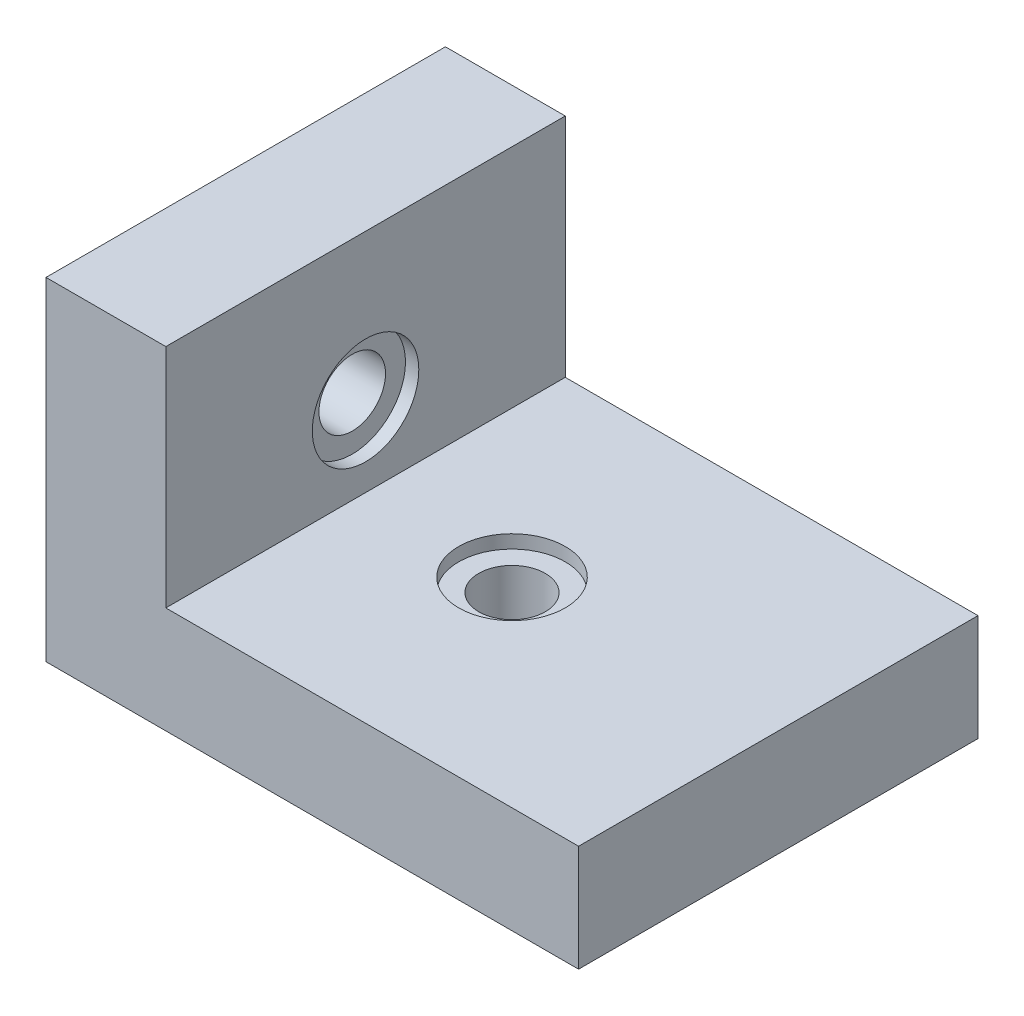
ISO-10303-21;
HEADER;
FILE_DESCRIPTION(('STEP AP214'),'2;1');
FILE_NAME('part.step','',(''),(''),'','','');
FILE_SCHEMA(('AUTOMOTIVE_DESIGN { 1 0 10303 214 1 1 1 1 }'));
ENDSEC;
DATA;
#1=APPLICATION_CONTEXT('core data for automotive mechanical design processes');
#2=APPLICATION_PROTOCOL_DEFINITION('international standard','automotive_design',2000,#1);
#3=PRODUCT_CONTEXT('',#1,'mechanical');
#4=PRODUCT('Part','Part','',(#3));
#5=PRODUCT_RELATED_PRODUCT_CATEGORY('part','',(#4));
#6=PRODUCT_DEFINITION_FORMATION('','',#4);
#7=PRODUCT_DEFINITION_CONTEXT('part definition',#1,'design');
#8=PRODUCT_DEFINITION('design','',#6,#7);
#9=PRODUCT_DEFINITION_SHAPE('','',#8);
#10=(LENGTH_UNIT() NAMED_UNIT(*) SI_UNIT(.MILLI.,.METRE.));
#11=(NAMED_UNIT(*) PLANE_ANGLE_UNIT() SI_UNIT($,.RADIAN.));
#12=(NAMED_UNIT(*) SI_UNIT($,.STERADIAN.) SOLID_ANGLE_UNIT());
#13=UNCERTAINTY_MEASURE_WITH_UNIT(LENGTH_MEASURE(1.E-05),#10,'distance_accuracy_value','');
#14=(GEOMETRIC_REPRESENTATION_CONTEXT(3) GLOBAL_UNCERTAINTY_ASSIGNED_CONTEXT((#13)) GLOBAL_UNIT_ASSIGNED_CONTEXT((#10,
#11,#12)) REPRESENTATION_CONTEXT('',''));
#15=CARTESIAN_POINT('',(0.,0.,0.));
#16=DIRECTION('',(0.,0.,1.));
#17=DIRECTION('',(1.,0.,0.));
#18=AXIS2_PLACEMENT_3D('',#15,#16,#17);
#19=CARTESIAN_POINT('',(9.,14.,15.));
#20=DIRECTION('',(-1.,0.,0.));
#21=DIRECTION('',(0.,0.,1.));
#22=AXIS2_PLACEMENT_3D('',#19,#20,#21);
#23=CYLINDRICAL_SURFACE('',#22,2.5);
#24=CARTESIAN_POINT('',(0.,14.,15.));
#25=DIRECTION('',(1.,0.,0.));
#26=DIRECTION('',(0.,0.,-1.));
#27=AXIS2_PLACEMENT_3D('',#24,#25,#26);
#28=CIRCLE('',#27,2.5);
#29=CARTESIAN_POINT('',(0.,14.,12.5));
#30=VERTEX_POINT('',#29);
#31=EDGE_CURVE('E116',#30,#30,#28,.T.);
#32=ORIENTED_EDGE('',*,*,#31,.F.);
#33=EDGE_LOOP('',(#32));
#34=FACE_BOUND('',#33,.T.);
#35=CARTESIAN_POINT('',(8.,14.,15.));
#36=DIRECTION('',(1.,0.,0.));
#37=DIRECTION('',(0.,0.,-1.));
#38=AXIS2_PLACEMENT_3D('',#35,#36,#37);
#39=CIRCLE('',#38,2.5);
#40=CARTESIAN_POINT('',(8.,14.,12.5));
#41=VERTEX_POINT('',#40);
#42=EDGE_CURVE('E40',#41,#41,#39,.T.);
#43=ORIENTED_EDGE('',*,*,#42,.T.);
#44=EDGE_LOOP('',(#43));
#45=FACE_BOUND('',#44,.T.);
#46=ADVANCED_FACE('F36',(#34,#45),#23,.F.);
#47=CARTESIAN_POINT('',(20.,8.,15.));
#48=DIRECTION('',(0.,-1.,0.));
#49=DIRECTION('',(0.,0.,-1.));
#50=AXIS2_PLACEMENT_3D('',#47,#48,#49);
#51=CYLINDRICAL_SURFACE('',#50,2.5);
#52=CARTESIAN_POINT('',(20.,0.,15.));
#53=DIRECTION('',(0.,1.,0.));
#54=DIRECTION('',(0.,0.,1.));
#55=AXIS2_PLACEMENT_3D('',#52,#53,#54);
#56=CIRCLE('',#55,2.5);
#57=CARTESIAN_POINT('',(20.,0.,17.5));
#58=VERTEX_POINT('',#57);
#59=EDGE_CURVE('E119',#58,#58,#56,.T.);
#60=ORIENTED_EDGE('',*,*,#59,.F.);
#61=EDGE_LOOP('',(#60));
#62=FACE_BOUND('',#61,.T.);
#63=CARTESIAN_POINT('',(20.,7.,15.));
#64=DIRECTION('',(0.,1.,0.));
#65=DIRECTION('',(0.,0.,1.));
#66=AXIS2_PLACEMENT_3D('',#63,#64,#65);
#67=CIRCLE('',#66,2.5);
#68=CARTESIAN_POINT('',(20.,7.,17.5));
#69=VERTEX_POINT('',#68);
#70=EDGE_CURVE('E141',#69,#69,#67,.T.);
#71=ORIENTED_EDGE('',*,*,#70,.T.);
#72=EDGE_LOOP('',(#71));
#73=FACE_BOUND('',#72,.T.);
#74=ADVANCED_FACE('F179',(#62,#73),#51,.F.);
#75=CARTESIAN_POINT('',(0.,8.,0.));
#76=DIRECTION('',(0.,1.,0.));
#77=DIRECTION('',(0.,0.,1.));
#78=AXIS2_PLACEMENT_3D('',#75,#76,#77);
#79=PLANE('',#78);
#80=CARTESIAN_POINT('',(20.,8.,15.));
#81=DIRECTION('',(0.,1.,0.));
#82=DIRECTION('',(0.,0.,1.));
#83=AXIS2_PLACEMENT_3D('',#80,#81,#82);
#84=CIRCLE('',#83,4.);
#85=CARTESIAN_POINT('',(20.,8.,19.));
#86=VERTEX_POINT('',#85);
#87=EDGE_CURVE('E149',#86,#86,#84,.T.);
#88=ORIENTED_EDGE('',*,*,#87,.F.);
#89=EDGE_LOOP('',(#88));
#90=FACE_BOUND('',#89,.T.);
#91=DIRECTION('',(-1.,0.,0.));
#92=VECTOR('',#91,1.);
#93=CARTESIAN_POINT('',(0.,8.,0.));
#94=LINE('',#93,#92);
#95=CARTESIAN_POINT('',(40.,8.,0.));
#96=VERTEX_POINT('',#95);
#97=CARTESIAN_POINT('',(9.,8.,0.));
#98=VERTEX_POINT('',#97);
#99=EDGE_CURVE('E58',#96,#98,#94,.T.);
#100=ORIENTED_EDGE('',*,*,#99,.T.);
#101=DIRECTION('',(0.,0.,1.));
#102=VECTOR('',#101,1.);
#103=CARTESIAN_POINT('',(9.,8.,0.));
#104=LINE('',#103,#102);
#105=CARTESIAN_POINT('',(9.,8.,30.));
#106=VERTEX_POINT('',#105);
#107=EDGE_CURVE('E53',#98,#106,#104,.T.);
#108=ORIENTED_EDGE('',*,*,#107,.T.);
#109=DIRECTION('',(1.,0.,0.));
#110=VECTOR('',#109,1.);
#111=CARTESIAN_POINT('',(0.,8.,30.));
#112=LINE('',#111,#110);
#113=CARTESIAN_POINT('',(40.,8.,30.));
#114=VERTEX_POINT('',#113);
#115=EDGE_CURVE('E123',#106,#114,#112,.T.);
#116=ORIENTED_EDGE('',*,*,#115,.T.);
#117=DIRECTION('',(0.,0.,-1.));
#118=VECTOR('',#117,1.);
#119=CARTESIAN_POINT('',(40.,8.,0.));
#120=LINE('',#119,#118);
#121=EDGE_CURVE('E125',#114,#96,#120,.T.);
#122=ORIENTED_EDGE('',*,*,#121,.T.);
#123=EDGE_LOOP('',(#100,#108,#116,#122));
#124=FACE_BOUND('',#123,.T.);
#125=ADVANCED_FACE('F162',(#90,#124),#79,.T.);
#126=CARTESIAN_POINT('',(0.,0.,0.));
#127=DIRECTION('',(0.,1.,0.));
#128=DIRECTION('',(0.,0.,1.));
#129=AXIS2_PLACEMENT_3D('',#126,#127,#128);
#130=PLANE('',#129);
#131=DIRECTION('',(0.,0.,1.));
#132=VECTOR('',#131,1.);
#133=CARTESIAN_POINT('',(0.,0.,0.));
#134=LINE('',#133,#132);
#135=CARTESIAN_POINT('',(0.,0.,0.));
#136=VERTEX_POINT('',#135);
#137=CARTESIAN_POINT('',(0.,0.,30.));
#138=VERTEX_POINT('',#137);
#139=EDGE_CURVE('E122',#136,#138,#134,.T.);
#140=ORIENTED_EDGE('',*,*,#139,.F.);
#141=DIRECTION('',(-1.,0.,0.));
#142=VECTOR('',#141,1.);
#143=CARTESIAN_POINT('',(0.,0.,0.));
#144=LINE('',#143,#142);
#145=CARTESIAN_POINT('',(40.,0.,0.));
#146=VERTEX_POINT('',#145);
#147=EDGE_CURVE('E126',#146,#136,#144,.T.);
#148=ORIENTED_EDGE('',*,*,#147,.F.);
#149=DIRECTION('',(0.,0.,-1.));
#150=VECTOR('',#149,1.);
#151=CARTESIAN_POINT('',(40.,0.,0.));
#152=LINE('',#151,#150);
#153=CARTESIAN_POINT('',(40.,0.,30.));
#154=VERTEX_POINT('',#153);
#155=EDGE_CURVE('E133',#154,#146,#152,.T.);
#156=ORIENTED_EDGE('',*,*,#155,.F.);
#157=DIRECTION('',(1.,0.,0.));
#158=VECTOR('',#157,1.);
#159=CARTESIAN_POINT('',(0.,0.,30.));
#160=LINE('',#159,#158);
#161=EDGE_CURVE('E131',#138,#154,#160,.T.);
#162=ORIENTED_EDGE('',*,*,#161,.F.);
#163=EDGE_LOOP('',(#140,#148,#156,#162));
#164=FACE_BOUND('',#163,.T.);
#165=ORIENTED_EDGE('',*,*,#59,.T.);
#166=EDGE_LOOP('',(#165));
#167=FACE_BOUND('',#166,.T.);
#168=ADVANCED_FACE('F170',(#164,#167),#130,.F.);
#169=CARTESIAN_POINT('',(0.,8.,0.));
#170=DIRECTION('',(1.,0.,0.));
#171=DIRECTION('',(0.,0.,-1.));
#172=AXIS2_PLACEMENT_3D('',#169,#170,#171);
#173=PLANE('',#172);
#174=ORIENTED_EDGE('',*,*,#139,.T.);
#175=DIRECTION('',(0.,-1.,0.));
#176=VECTOR('',#175,1.);
#177=CARTESIAN_POINT('',(0.,8.,30.));
#178=LINE('',#177,#176);
#179=CARTESIAN_POINT('',(0.,25.,30.));
#180=VERTEX_POINT('',#179);
#181=EDGE_CURVE('E11',#180,#138,#178,.T.);
#182=ORIENTED_EDGE('',*,*,#181,.F.);
#183=DIRECTION('',(0.,0.,1.));
#184=VECTOR('',#183,1.);
#185=CARTESIAN_POINT('',(0.,25.,30.));
#186=LINE('',#185,#184);
#187=CARTESIAN_POINT('',(0.,25.,0.));
#188=VERTEX_POINT('',#187);
#189=EDGE_CURVE('E115',#188,#180,#186,.T.);
#190=ORIENTED_EDGE('',*,*,#189,.F.);
#191=DIRECTION('',(0.,-1.,0.));
#192=VECTOR('',#191,1.);
#193=CARTESIAN_POINT('',(0.,8.,0.));
#194=LINE('',#193,#192);
#195=EDGE_CURVE('E102',#188,#136,#194,.T.);
#196=ORIENTED_EDGE('',*,*,#195,.T.);
#197=EDGE_LOOP('',(#174,#182,#190,#196));
#198=FACE_BOUND('',#197,.T.);
#199=ORIENTED_EDGE('',*,*,#31,.T.);
#200=EDGE_LOOP('',(#199));
#201=FACE_BOUND('',#200,.T.);
#202=ADVANCED_FACE('F38',(#198,#201),#173,.F.);
#203=CARTESIAN_POINT('',(0.,8.,30.));
#204=DIRECTION('',(0.,0.,-1.));
#205=DIRECTION('',(-1.,0.,0.));
#206=AXIS2_PLACEMENT_3D('',#203,#204,#205);
#207=PLANE('',#206);
#208=ORIENTED_EDGE('',*,*,#161,.T.);
#209=DIRECTION('',(0.,-1.,0.));
#210=VECTOR('',#209,1.);
#211=CARTESIAN_POINT('',(40.,8.,30.));
#212=LINE('',#211,#210);
#213=EDGE_CURVE('E45',#114,#154,#212,.T.);
#214=ORIENTED_EDGE('',*,*,#213,.F.);
#215=ORIENTED_EDGE('',*,*,#115,.F.);
#216=DIRECTION('',(0.,-1.,0.));
#217=VECTOR('',#216,1.);
#218=CARTESIAN_POINT('',(9.,0.,30.));
#219=LINE('',#218,#217);
#220=CARTESIAN_POINT('',(9.,25.,30.));
#221=VERTEX_POINT('',#220);
#222=EDGE_CURVE('E96',#221,#106,#219,.T.);
#223=ORIENTED_EDGE('',*,*,#222,.F.);
#224=DIRECTION('',(-1.,0.,0.));
#225=VECTOR('',#224,1.);
#226=CARTESIAN_POINT('',(9.,25.,30.));
#227=LINE('',#226,#225);
#228=EDGE_CURVE('E106',#221,#180,#227,.T.);
#229=ORIENTED_EDGE('',*,*,#228,.T.);
#230=ORIENTED_EDGE('',*,*,#181,.T.);
#231=EDGE_LOOP('',(#208,#214,#215,#223,#229,#230));
#232=FACE_BOUND('',#231,.T.);
#233=ADVANCED_FACE('F159',(#232),#207,.F.);
#234=CARTESIAN_POINT('',(40.,8.,0.));
#235=DIRECTION('',(-1.,0.,0.));
#236=DIRECTION('',(0.,0.,1.));
#237=AXIS2_PLACEMENT_3D('',#234,#235,#236);
#238=PLANE('',#237);
#239=ORIENTED_EDGE('',*,*,#155,.T.);
#240=DIRECTION('',(0.,-1.,0.));
#241=VECTOR('',#240,1.);
#242=CARTESIAN_POINT('',(40.,8.,0.));
#243=LINE('',#242,#241);
#244=EDGE_CURVE('E137',#96,#146,#243,.T.);
#245=ORIENTED_EDGE('',*,*,#244,.F.);
#246=ORIENTED_EDGE('',*,*,#121,.F.);
#247=ORIENTED_EDGE('',*,*,#213,.T.);
#248=EDGE_LOOP('',(#239,#245,#246,#247));
#249=FACE_BOUND('',#248,.T.);
#250=ADVANCED_FACE('F165',(#249),#238,.F.);
#251=CARTESIAN_POINT('',(0.,8.,0.));
#252=DIRECTION('',(0.,0.,1.));
#253=DIRECTION('',(1.,0.,0.));
#254=AXIS2_PLACEMENT_3D('',#251,#252,#253);
#255=PLANE('',#254);
#256=ORIENTED_EDGE('',*,*,#195,.F.);
#257=DIRECTION('',(-1.,0.,0.));
#258=VECTOR('',#257,1.);
#259=CARTESIAN_POINT('',(9.,25.,0.));
#260=LINE('',#259,#258);
#261=CARTESIAN_POINT('',(9.,25.,0.));
#262=VERTEX_POINT('',#261);
#263=EDGE_CURVE('E99',#262,#188,#260,.T.);
#264=ORIENTED_EDGE('',*,*,#263,.F.);
#265=DIRECTION('',(0.,1.,0.));
#266=VECTOR('',#265,1.);
#267=CARTESIAN_POINT('',(9.,0.,0.));
#268=LINE('',#267,#266);
#269=EDGE_CURVE('E88',#98,#262,#268,.T.);
#270=ORIENTED_EDGE('',*,*,#269,.F.);
#271=ORIENTED_EDGE('',*,*,#99,.F.);
#272=ORIENTED_EDGE('',*,*,#244,.T.);
#273=ORIENTED_EDGE('',*,*,#147,.T.);
#274=EDGE_LOOP('',(#256,#264,#270,#271,#272,#273));
#275=FACE_BOUND('',#274,.T.);
#276=ADVANCED_FACE('F100',(#275),#255,.F.);
#277=CARTESIAN_POINT('',(9.,0.,0.));
#278=DIRECTION('',(-1.,0.,0.));
#279=DIRECTION('',(0.,0.,1.));
#280=AXIS2_PLACEMENT_3D('',#277,#278,#279);
#281=PLANE('',#280);
#282=CARTESIAN_POINT('',(9.,14.,15.));
#283=DIRECTION('',(1.,0.,0.));
#284=DIRECTION('',(0.,0.,-1.));
#285=AXIS2_PLACEMENT_3D('',#282,#283,#284);
#286=CIRCLE('',#285,4.);
#287=CARTESIAN_POINT('',(9.,14.,11.));
#288=VERTEX_POINT('',#287);
#289=EDGE_CURVE('E156',#288,#288,#286,.T.);
#290=ORIENTED_EDGE('',*,*,#289,.F.);
#291=EDGE_LOOP('',(#290));
#292=FACE_BOUND('',#291,.T.);
#293=ORIENTED_EDGE('',*,*,#107,.F.);
#294=ORIENTED_EDGE('',*,*,#269,.T.);
#295=DIRECTION('',(0.,0.,1.));
#296=VECTOR('',#295,1.);
#297=CARTESIAN_POINT('',(9.,25.,30.));
#298=LINE('',#297,#296);
#299=EDGE_CURVE('E93',#262,#221,#298,.T.);
#300=ORIENTED_EDGE('',*,*,#299,.T.);
#301=ORIENTED_EDGE('',*,*,#222,.T.);
#302=EDGE_LOOP('',(#293,#294,#300,#301));
#303=FACE_BOUND('',#302,.T.);
#304=ADVANCED_FACE('F90',(#292,#303),#281,.F.);
#305=CARTESIAN_POINT('',(9.,25.,30.));
#306=DIRECTION('',(0.,-1.,0.));
#307=DIRECTION('',(0.,0.,-1.));
#308=AXIS2_PLACEMENT_3D('',#305,#306,#307);
#309=PLANE('',#308);
#310=ORIENTED_EDGE('',*,*,#189,.T.);
#311=ORIENTED_EDGE('',*,*,#228,.F.);
#312=ORIENTED_EDGE('',*,*,#299,.F.);
#313=ORIENTED_EDGE('',*,*,#263,.T.);
#314=EDGE_LOOP('',(#310,#311,#312,#313));
#315=FACE_BOUND('',#314,.T.);
#316=ADVANCED_FACE('F108',(#315),#309,.F.);
#317=CARTESIAN_POINT('',(20.,7.,15.));
#318=DIRECTION('',(0.,1.,0.));
#319=DIRECTION('',(0.,0.,1.));
#320=AXIS2_PLACEMENT_3D('',#317,#318,#319);
#321=CYLINDRICAL_SURFACE('',#320,4.);
#322=CARTESIAN_POINT('',(20.,7.,15.));
#323=DIRECTION('',(0.,1.,0.));
#324=DIRECTION('',(0.,0.,1.));
#325=AXIS2_PLACEMENT_3D('',#322,#323,#324);
#326=CIRCLE('',#325,4.);
#327=CARTESIAN_POINT('',(20.,7.,19.));
#328=VERTEX_POINT('',#327);
#329=EDGE_CURVE('E143',#328,#328,#326,.T.);
#330=ORIENTED_EDGE('',*,*,#329,.F.);
#331=EDGE_LOOP('',(#330));
#332=FACE_BOUND('',#331,.T.);
#333=ORIENTED_EDGE('',*,*,#87,.T.);
#334=EDGE_LOOP('',(#333));
#335=FACE_BOUND('',#334,.T.);
#336=ADVANCED_FACE('F199',(#332,#335),#321,.F.);
#337=CARTESIAN_POINT('',(20.,7.,15.));
#338=DIRECTION('',(0.,1.,0.));
#339=DIRECTION('',(0.,0.,1.));
#340=AXIS2_PLACEMENT_3D('',#337,#338,#339);
#341=PLANE('',#340);
#342=ORIENTED_EDGE('',*,*,#70,.F.);
#343=EDGE_LOOP('',(#342));
#344=FACE_BOUND('',#343,.T.);
#345=ORIENTED_EDGE('',*,*,#329,.T.);
#346=EDGE_LOOP('',(#345));
#347=FACE_BOUND('',#346,.T.);
#348=ADVANCED_FACE('F257',(#344,#347),#341,.T.);
#349=CARTESIAN_POINT('',(8.,14.,15.));
#350=DIRECTION('',(1.,0.,0.));
#351=DIRECTION('',(0.,0.,-1.));
#352=AXIS2_PLACEMENT_3D('',#349,#350,#351);
#353=CYLINDRICAL_SURFACE('',#352,4.);
#354=CARTESIAN_POINT('',(8.,14.,15.));
#355=DIRECTION('',(1.,0.,0.));
#356=DIRECTION('',(0.,0.,-1.));
#357=AXIS2_PLACEMENT_3D('',#354,#355,#356);
#358=CIRCLE('',#357,4.);
#359=CARTESIAN_POINT('',(8.,14.,11.));
#360=VERTEX_POINT('',#359);
#361=EDGE_CURVE('E184',#360,#360,#358,.T.);
#362=ORIENTED_EDGE('',*,*,#361,.F.);
#363=EDGE_LOOP('',(#362));
#364=FACE_BOUND('',#363,.T.);
#365=ORIENTED_EDGE('',*,*,#289,.T.);
#366=EDGE_LOOP('',(#365));
#367=FACE_BOUND('',#366,.T.);
#368=ADVANCED_FACE('F191',(#364,#367),#353,.F.);
#369=CARTESIAN_POINT('',(8.,14.,15.));
#370=DIRECTION('',(1.,0.,0.));
#371=DIRECTION('',(0.,0.,-1.));
#372=AXIS2_PLACEMENT_3D('',#369,#370,#371);
#373=PLANE('',#372);
#374=ORIENTED_EDGE('',*,*,#42,.F.);
#375=EDGE_LOOP('',(#374));
#376=FACE_BOUND('',#375,.T.);
#377=ORIENTED_EDGE('',*,*,#361,.T.);
#378=EDGE_LOOP('',(#377));
#379=FACE_BOUND('',#378,.T.);
#380=ADVANCED_FACE('F284',(#376,#379),#373,.T.);
#381=CLOSED_SHELL('',(#46,#74,#125,#168,#202,#233,#250,#276,#304,#316,#336,#348,#368,#380));
#382=MANIFOLD_SOLID_BREP('B2',#381);
#383=ADVANCED_BREP_SHAPE_REPRESENTATION('',(#18,#382),#14);
#384=SHAPE_DEFINITION_REPRESENTATION(#9,#383);
ENDSEC;
END-ISO-10303-21;
